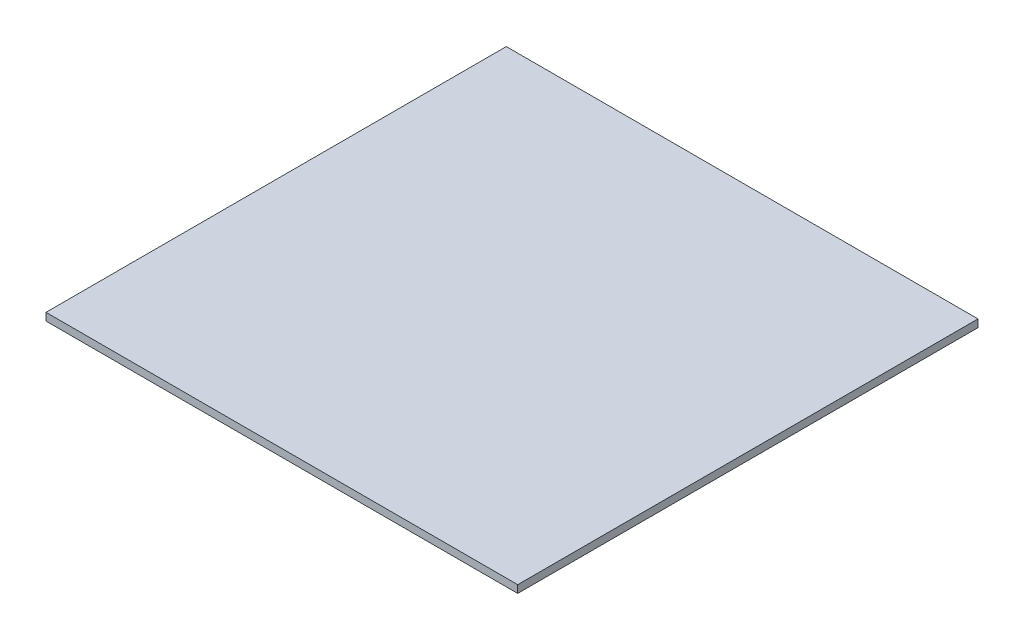
ISO-10303-21;
HEADER;
FILE_DESCRIPTION(('STEP AP214'),'2;1');
FILE_NAME('part.step','',(''),(''),'','','');
FILE_SCHEMA(('AUTOMOTIVE_DESIGN { 1 0 10303 214 1 1 1 1 }'));
ENDSEC;
DATA;
#1=APPLICATION_CONTEXT('core data for automotive mechanical design processes');
#2=APPLICATION_PROTOCOL_DEFINITION('international standard','automotive_design',2000,#1);
#3=PRODUCT_CONTEXT('',#1,'mechanical');
#4=PRODUCT('Part','Part','',(#3));
#5=PRODUCT_RELATED_PRODUCT_CATEGORY('part','',(#4));
#6=PRODUCT_DEFINITION_FORMATION('','',#4);
#7=PRODUCT_DEFINITION_CONTEXT('part definition',#1,'design');
#8=PRODUCT_DEFINITION('design','',#6,#7);
#9=PRODUCT_DEFINITION_SHAPE('','',#8);
#10=(LENGTH_UNIT() NAMED_UNIT(*) SI_UNIT(.MILLI.,.METRE.));
#11=(NAMED_UNIT(*) PLANE_ANGLE_UNIT() SI_UNIT($,.RADIAN.));
#12=(NAMED_UNIT(*) SI_UNIT($,.STERADIAN.) SOLID_ANGLE_UNIT());
#13=UNCERTAINTY_MEASURE_WITH_UNIT(LENGTH_MEASURE(1.E-05),#10,'distance_accuracy_value','');
#14=(GEOMETRIC_REPRESENTATION_CONTEXT(3) GLOBAL_UNCERTAINTY_ASSIGNED_CONTEXT((#13)) GLOBAL_UNIT_ASSIGNED_CONTEXT((#10,
#11,#12)) REPRESENTATION_CONTEXT('',''));
#15=CARTESIAN_POINT('',(0.,0.,0.));
#16=DIRECTION('',(0.,0.,1.));
#17=DIRECTION('',(1.,0.,0.));
#18=AXIS2_PLACEMENT_3D('',#15,#16,#17);
#19=CARTESIAN_POINT('',(248.,8.,242.));
#20=DIRECTION('',(-1.,0.,0.));
#21=DIRECTION('',(0.,0.,1.));
#22=AXIS2_PLACEMENT_3D('',#19,#20,#21);
#23=PLANE('',#22);
#24=DIRECTION('',(0.,0.,-1.));
#25=VECTOR('',#24,1.);
#26=CARTESIAN_POINT('',(248.,0.,242.));
#27=LINE('',#26,#25);
#28=CARTESIAN_POINT('',(248.,0.,242.));
#29=VERTEX_POINT('',#28);
#30=CARTESIAN_POINT('',(248.,0.,-242.));
#31=VERTEX_POINT('',#30);
#32=EDGE_CURVE('E107',#29,#31,#27,.T.);
#33=ORIENTED_EDGE('',*,*,#32,.T.);
#34=DIRECTION('',(0.,-1.,0.));
#35=VECTOR('',#34,1.);
#36=CARTESIAN_POINT('',(248.,8.,-242.));
#37=LINE('',#36,#35);
#38=CARTESIAN_POINT('',(248.,8.,-242.));
#39=VERTEX_POINT('',#38);
#40=EDGE_CURVE('E11',#39,#31,#37,.T.);
#41=ORIENTED_EDGE('',*,*,#40,.F.);
#42=DIRECTION('',(0.,0.,-1.));
#43=VECTOR('',#42,1.);
#44=CARTESIAN_POINT('',(248.,8.,242.));
#45=LINE('',#44,#43);
#46=CARTESIAN_POINT('',(248.,8.,242.));
#47=VERTEX_POINT('',#46);
#48=EDGE_CURVE('E90',#47,#39,#45,.T.);
#49=ORIENTED_EDGE('',*,*,#48,.F.);
#50=DIRECTION('',(0.,-1.,0.));
#51=VECTOR('',#50,1.);
#52=CARTESIAN_POINT('',(248.,8.,242.));
#53=LINE('',#52,#51);
#54=EDGE_CURVE('E103',#47,#29,#53,.T.);
#55=ORIENTED_EDGE('',*,*,#54,.T.);
#56=EDGE_LOOP('',(#33,#41,#49,#55));
#57=FACE_BOUND('',#56,.T.);
#58=ADVANCED_FACE('F38',(#57),#23,.F.);
#59=CARTESIAN_POINT('',(-248.,8.,-242.));
#60=DIRECTION('',(0.,0.,1.));
#61=DIRECTION('',(1.,0.,0.));
#62=AXIS2_PLACEMENT_3D('',#59,#60,#61);
#63=PLANE('',#62);
#64=DIRECTION('',(-1.,0.,0.));
#65=VECTOR('',#64,1.);
#66=CARTESIAN_POINT('',(-248.,0.,-242.));
#67=LINE('',#66,#65);
#68=CARTESIAN_POINT('',(-248.,0.,-242.));
#69=VERTEX_POINT('',#68);
#70=EDGE_CURVE('E95',#31,#69,#67,.T.);
#71=ORIENTED_EDGE('',*,*,#70,.T.);
#72=DIRECTION('',(0.,-1.,0.));
#73=VECTOR('',#72,1.);
#74=CARTESIAN_POINT('',(-248.,8.,-242.));
#75=LINE('',#74,#73);
#76=CARTESIAN_POINT('',(-248.,8.,-242.));
#77=VERTEX_POINT('',#76);
#78=EDGE_CURVE('E47',#77,#69,#75,.T.);
#79=ORIENTED_EDGE('',*,*,#78,.F.);
#80=DIRECTION('',(-1.,0.,0.));
#81=VECTOR('',#80,1.);
#82=CARTESIAN_POINT('',(-248.,8.,-242.));
#83=LINE('',#82,#81);
#84=EDGE_CURVE('E85',#39,#77,#83,.T.);
#85=ORIENTED_EDGE('',*,*,#84,.F.);
#86=ORIENTED_EDGE('',*,*,#40,.T.);
#87=EDGE_LOOP('',(#71,#79,#85,#86));
#88=FACE_BOUND('',#87,.T.);
#89=ADVANCED_FACE('F94',(#88),#63,.F.);
#90=CARTESIAN_POINT('',(-248.,8.,242.));
#91=DIRECTION('',(1.,0.,0.));
#92=DIRECTION('',(0.,0.,-1.));
#93=AXIS2_PLACEMENT_3D('',#90,#91,#92);
#94=PLANE('',#93);
#95=DIRECTION('',(0.,0.,1.));
#96=VECTOR('',#95,1.);
#97=CARTESIAN_POINT('',(-248.,0.,242.));
#98=LINE('',#97,#96);
#99=CARTESIAN_POINT('',(-248.,0.,242.));
#100=VERTEX_POINT('',#99);
#101=EDGE_CURVE('E72',#69,#100,#98,.T.);
#102=ORIENTED_EDGE('',*,*,#101,.T.);
#103=DIRECTION('',(0.,-1.,0.));
#104=VECTOR('',#103,1.);
#105=CARTESIAN_POINT('',(-248.,8.,242.));
#106=LINE('',#105,#104);
#107=CARTESIAN_POINT('',(-248.,8.,242.));
#108=VERTEX_POINT('',#107);
#109=EDGE_CURVE('E97',#108,#100,#106,.T.);
#110=ORIENTED_EDGE('',*,*,#109,.F.);
#111=DIRECTION('',(0.,0.,1.));
#112=VECTOR('',#111,1.);
#113=CARTESIAN_POINT('',(-248.,8.,242.));
#114=LINE('',#113,#112);
#115=EDGE_CURVE('E88',#77,#108,#114,.T.);
#116=ORIENTED_EDGE('',*,*,#115,.F.);
#117=ORIENTED_EDGE('',*,*,#78,.T.);
#118=EDGE_LOOP('',(#102,#110,#116,#117));
#119=FACE_BOUND('',#118,.T.);
#120=ADVANCED_FACE('F98',(#119),#94,.F.);
#121=CARTESIAN_POINT('',(-248.,8.,242.));
#122=DIRECTION('',(0.,0.,-1.));
#123=DIRECTION('',(-1.,0.,0.));
#124=AXIS2_PLACEMENT_3D('',#121,#122,#123);
#125=PLANE('',#124);
#126=DIRECTION('',(1.,0.,0.));
#127=VECTOR('',#126,1.);
#128=CARTESIAN_POINT('',(-248.,0.,242.));
#129=LINE('',#128,#127);
#130=EDGE_CURVE('E78',#100,#29,#129,.T.);
#131=ORIENTED_EDGE('',*,*,#130,.T.);
#132=ORIENTED_EDGE('',*,*,#54,.F.);
#133=DIRECTION('',(1.,0.,0.));
#134=VECTOR('',#133,1.);
#135=CARTESIAN_POINT('',(-248.,8.,242.));
#136=LINE('',#135,#134);
#137=EDGE_CURVE('E55',#108,#47,#136,.T.);
#138=ORIENTED_EDGE('',*,*,#137,.F.);
#139=ORIENTED_EDGE('',*,*,#109,.T.);
#140=EDGE_LOOP('',(#131,#132,#138,#139));
#141=FACE_BOUND('',#140,.T.);
#142=ADVANCED_FACE('F120',(#141),#125,.F.);
#143=CARTESIAN_POINT('',(0.,8.,0.));
#144=DIRECTION('',(0.,-1.,0.));
#145=DIRECTION('',(0.,0.,-1.));
#146=AXIS2_PLACEMENT_3D('',#143,#144,#145);
#147=PLANE('',#146);
#148=ORIENTED_EDGE('',*,*,#48,.T.);
#149=ORIENTED_EDGE('',*,*,#84,.T.);
#150=ORIENTED_EDGE('',*,*,#115,.T.);
#151=ORIENTED_EDGE('',*,*,#137,.T.);
#152=EDGE_LOOP('',(#148,#149,#150,#151));
#153=FACE_BOUND('',#152,.T.);
#154=ADVANCED_FACE('F86',(#153),#147,.F.);
#155=CARTESIAN_POINT('',(0.,0.,0.));
#156=DIRECTION('',(0.,-1.,0.));
#157=DIRECTION('',(0.,0.,-1.));
#158=AXIS2_PLACEMENT_3D('',#155,#156,#157);
#159=PLANE('',#158);
#160=ORIENTED_EDGE('',*,*,#32,.F.);
#161=ORIENTED_EDGE('',*,*,#130,.F.);
#162=ORIENTED_EDGE('',*,*,#101,.F.);
#163=ORIENTED_EDGE('',*,*,#70,.F.);
#164=EDGE_LOOP('',(#160,#161,#162,#163));
#165=FACE_BOUND('',#164,.T.);
#166=ADVANCED_FACE('F123',(#165),#159,.T.);
#167=CLOSED_SHELL('',(#58,#89,#120,#142,#154,#166));
#168=MANIFOLD_SOLID_BREP('B2',#167);
#169=ADVANCED_BREP_SHAPE_REPRESENTATION('',(#18,#168),#14);
#170=SHAPE_DEFINITION_REPRESENTATION(#9,#169);
ENDSEC;
END-ISO-10303-21;
